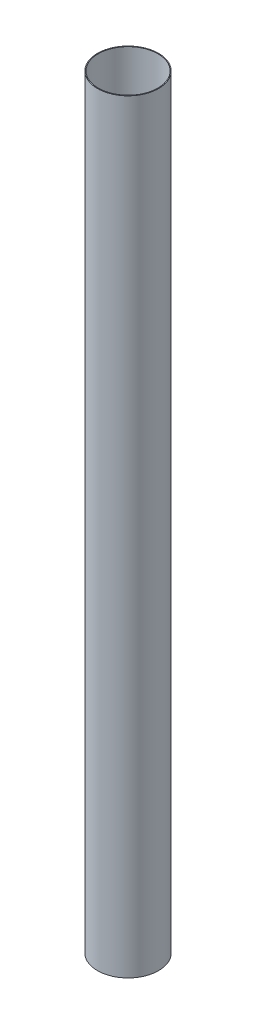
ISO-10303-21;
HEADER;
FILE_DESCRIPTION(('STEP AP214'),'2;1');
FILE_NAME('part.step','',(''),(''),'','','');
FILE_SCHEMA(('AUTOMOTIVE_DESIGN { 1 0 10303 214 1 1 1 1 }'));
ENDSEC;
DATA;
#1=APPLICATION_CONTEXT('core data for automotive mechanical design processes');
#2=APPLICATION_PROTOCOL_DEFINITION('international standard','automotive_design',2000,#1);
#3=PRODUCT_CONTEXT('',#1,'mechanical');
#4=PRODUCT('Part','Part','',(#3));
#5=PRODUCT_RELATED_PRODUCT_CATEGORY('part','',(#4));
#6=PRODUCT_DEFINITION_FORMATION('','',#4);
#7=PRODUCT_DEFINITION_CONTEXT('part definition',#1,'design');
#8=PRODUCT_DEFINITION('design','',#6,#7);
#9=PRODUCT_DEFINITION_SHAPE('','',#8);
#10=(LENGTH_UNIT() NAMED_UNIT(*) SI_UNIT(.MILLI.,.METRE.));
#11=(NAMED_UNIT(*) PLANE_ANGLE_UNIT() SI_UNIT($,.RADIAN.));
#12=(NAMED_UNIT(*) SI_UNIT($,.STERADIAN.) SOLID_ANGLE_UNIT());
#13=UNCERTAINTY_MEASURE_WITH_UNIT(LENGTH_MEASURE(1.E-05),#10,'distance_accuracy_value','');
#14=(GEOMETRIC_REPRESENTATION_CONTEXT(3) GLOBAL_UNCERTAINTY_ASSIGNED_CONTEXT((#13)) GLOBAL_UNIT_ASSIGNED_CONTEXT((#10,
#11,#12)) REPRESENTATION_CONTEXT('',''));
#15=CARTESIAN_POINT('',(0.,0.,0.));
#16=DIRECTION('',(0.,0.,1.));
#17=DIRECTION('',(1.,0.,0.));
#18=AXIS2_PLACEMENT_3D('',#15,#16,#17);
#19=CARTESIAN_POINT('',(0.,1270.,0.));
#20=DIRECTION('',(0.,1.,0.));
#21=DIRECTION('',(0.,0.,1.));
#22=AXIS2_PLACEMENT_3D('',#19,#20,#21);
#23=PLANE('',#22);
#24=CARTESIAN_POINT('',(0.,1270.,0.));
#25=DIRECTION('',(0.,1.,0.));
#26=DIRECTION('',(0.,0.,1.));
#27=AXIS2_PLACEMENT_3D('',#24,#25,#26);
#28=CIRCLE('',#27,50.8);
#29=CARTESIAN_POINT('',(0.,1270.,-50.8));
#30=VERTEX_POINT('',#29);
#31=EDGE_CURVE('E10',#30,#30,#28,.T.);
#32=ORIENTED_EDGE('',*,*,#31,.T.);
#33=EDGE_LOOP('',(#32));
#34=FACE_BOUND('',#33,.T.);
#35=CARTESIAN_POINT('',(0.,1270.,0.));
#36=DIRECTION('',(0.,1.,0.));
#37=DIRECTION('',(0.,0.,1.));
#38=AXIS2_PLACEMENT_3D('',#35,#36,#37);
#39=CIRCLE('',#38,49.53);
#40=CARTESIAN_POINT('',(0.,1270.,-49.53));
#41=VERTEX_POINT('',#40);
#42=EDGE_CURVE('E41',#41,#41,#39,.T.);
#43=ORIENTED_EDGE('',*,*,#42,.F.);
#44=EDGE_LOOP('',(#43));
#45=FACE_BOUND('',#44,.T.);
#46=ADVANCED_FACE('F30',(#34,#45),#23,.T.);
#47=CARTESIAN_POINT('',(0.,0.,0.));
#48=DIRECTION('',(0.,1.,0.));
#49=DIRECTION('',(0.,0.,1.));
#50=AXIS2_PLACEMENT_3D('',#47,#48,#49);
#51=PLANE('',#50);
#52=CARTESIAN_POINT('',(0.,0.,0.));
#53=DIRECTION('',(0.,1.,0.));
#54=DIRECTION('',(0.,0.,1.));
#55=AXIS2_PLACEMENT_3D('',#52,#53,#54);
#56=CIRCLE('',#55,50.8);
#57=CARTESIAN_POINT('',(0.,-2.22044604925031E-13,-50.8));
#58=VERTEX_POINT('',#57);
#59=EDGE_CURVE('E34',#58,#58,#56,.T.);
#60=ORIENTED_EDGE('',*,*,#59,.F.);
#61=EDGE_LOOP('',(#60));
#62=FACE_BOUND('',#61,.T.);
#63=CARTESIAN_POINT('',(0.,0.,0.));
#64=DIRECTION('',(0.,1.,0.));
#65=DIRECTION('',(0.,0.,1.));
#66=AXIS2_PLACEMENT_3D('',#63,#64,#65);
#67=CIRCLE('',#66,49.53);
#68=CARTESIAN_POINT('',(0.,-2.22044604925031E-13,-49.53));
#69=VERTEX_POINT('',#68);
#70=EDGE_CURVE('E43',#69,#69,#67,.T.);
#71=ORIENTED_EDGE('',*,*,#70,.T.);
#72=EDGE_LOOP('',(#71));
#73=FACE_BOUND('',#72,.T.);
#74=ADVANCED_FACE('F53',(#62,#73),#51,.F.);
#75=CARTESIAN_POINT('',(0.,1270.,0.));
#76=DIRECTION('',(0.,-1.,0.));
#77=DIRECTION('',(0.,0.,-1.));
#78=AXIS2_PLACEMENT_3D('',#75,#76,#77);
#79=CYLINDRICAL_SURFACE('',#78,50.8);
#80=CARTESIAN_POINT('',(0.,1270.,-50.8));
#81=CARTESIAN_POINT('',(0.,1256.77083333333,-50.8));
#82=CARTESIAN_POINT('',(0.,1243.54166666667,-50.8));
#83=CARTESIAN_POINT('',(0.,1217.08333333333,-50.8));
#84=CARTESIAN_POINT('',(0.,1203.85416666667,-50.8));
#85=CARTESIAN_POINT('',(0.,1177.39583333333,-50.8));
#86=CARTESIAN_POINT('',(0.,1164.16666666667,-50.8));
#87=CARTESIAN_POINT('',(0.,1137.70833333333,-50.8));
#88=CARTESIAN_POINT('',(0.,1124.47916666667,-50.8));
#89=CARTESIAN_POINT('',(0.,1098.02083333333,-50.8));
#90=CARTESIAN_POINT('',(0.,1084.79166666667,-50.8));
#91=CARTESIAN_POINT('',(0.,1058.33333333333,-50.8));
#92=CARTESIAN_POINT('',(0.,1045.10416666667,-50.8));
#93=CARTESIAN_POINT('',(0.,1018.64583333333,-50.8));
#94=CARTESIAN_POINT('',(0.,1005.41666666667,-50.8));
#95=CARTESIAN_POINT('',(0.,978.958333333333,-50.8));
#96=CARTESIAN_POINT('',(0.,965.729166666667,-50.8));
#97=CARTESIAN_POINT('',(0.,939.270833333333,-50.8));
#98=CARTESIAN_POINT('',(0.,926.041666666667,-50.8));
#99=CARTESIAN_POINT('',(0.,899.583333333333,-50.8));
#100=CARTESIAN_POINT('',(0.,886.354166666667,-50.8));
#101=CARTESIAN_POINT('',(0.,859.895833333333,-50.8));
#102=CARTESIAN_POINT('',(0.,846.666666666667,-50.8));
#103=CARTESIAN_POINT('',(0.,820.208333333333,-50.8));
#104=CARTESIAN_POINT('',(0.,806.979166666667,-50.8));
#105=CARTESIAN_POINT('',(0.,780.520833333333,-50.8));
#106=CARTESIAN_POINT('',(0.,767.291666666667,-50.8));
#107=CARTESIAN_POINT('',(0.,740.833333333333,-50.8));
#108=CARTESIAN_POINT('',(0.,727.604166666667,-50.8));
#109=CARTESIAN_POINT('',(0.,701.145833333333,-50.8));
#110=CARTESIAN_POINT('',(0.,687.916666666667,-50.8));
#111=CARTESIAN_POINT('',(0.,661.458333333333,-50.8));
#112=CARTESIAN_POINT('',(0.,648.229166666667,-50.8));
#113=CARTESIAN_POINT('',(0.,621.770833333333,-50.8));
#114=CARTESIAN_POINT('',(0.,608.541666666667,-50.8));
#115=CARTESIAN_POINT('',(0.,582.083333333333,-50.8));
#116=CARTESIAN_POINT('',(0.,568.854166666667,-50.8));
#117=CARTESIAN_POINT('',(0.,542.395833333333,-50.8));
#118=CARTESIAN_POINT('',(0.,529.166666666667,-50.8));
#119=CARTESIAN_POINT('',(0.,502.708333333333,-50.8));
#120=CARTESIAN_POINT('',(0.,489.479166666667,-50.8));
#121=CARTESIAN_POINT('',(0.,463.020833333333,-50.8));
#122=CARTESIAN_POINT('',(0.,449.791666666667,-50.8));
#123=CARTESIAN_POINT('',(0.,423.333333333333,-50.8));
#124=CARTESIAN_POINT('',(0.,410.104166666667,-50.8));
#125=CARTESIAN_POINT('',(0.,383.645833333333,-50.8));
#126=CARTESIAN_POINT('',(0.,370.416666666667,-50.8));
#127=CARTESIAN_POINT('',(0.,343.958333333333,-50.8));
#128=CARTESIAN_POINT('',(0.,330.729166666667,-50.8));
#129=CARTESIAN_POINT('',(0.,304.270833333333,-50.8));
#130=CARTESIAN_POINT('',(0.,291.041666666666,-50.8));
#131=CARTESIAN_POINT('',(0.,264.583333333333,-50.8));
#132=CARTESIAN_POINT('',(0.,251.354166666667,-50.8));
#133=CARTESIAN_POINT('',(0.,224.895833333333,-50.8));
#134=CARTESIAN_POINT('',(0.,211.666666666667,-50.8));
#135=CARTESIAN_POINT('',(0.,185.208333333333,-50.8));
#136=CARTESIAN_POINT('',(0.,171.979166666666,-50.8));
#137=CARTESIAN_POINT('',(0.,145.520833333333,-50.8));
#138=CARTESIAN_POINT('',(0.,132.291666666666,-50.8));
#139=CARTESIAN_POINT('',(0.,105.833333333333,-50.8));
#140=CARTESIAN_POINT('',(0.,92.6041666666664,-50.8));
#141=CARTESIAN_POINT('',(0.,66.1458333333331,-50.8));
#142=CARTESIAN_POINT('',(0.,52.9166666666665,-50.8));
#143=CARTESIAN_POINT('',(0.,26.4583333333332,-50.8));
#144=CARTESIAN_POINT('',(0.,13.2291666666665,-50.8));
#145=CARTESIAN_POINT('',(0.,-2.22044604925031E-13,-50.8));
#146=B_SPLINE_CURVE_WITH_KNOTS('',3,(#80,#81,#82,#83,#84,#85,#86,#87,#88,#89,#90,#91,#92,#93,
#94,#95,#96,#97,#98,#99,#100,#101,#102,#103,#104,#105,#106,#107,#108,#109,#110,#111,#112,#113,
#114,#115,#116,#117,#118,#119,#120,#121,#122,#123,#124,#125,#126,#127,#128,#129,#130,#131,#132,
#133,#134,#135,#136,#137,#138,#139,#140,#141,#142,#143,#144,#145),.UNSPECIFIED.,.F.,.F.,(4,2,2,
2,2,2,2,2,2,2,2,2,2,2,2,2,2,2,2,2,2,2,2,2,2,2,2,2,2,2,2,2,4),(0.,39.6874999999999,79.375,
119.0625,158.75,198.4375,238.125,277.8125,317.5,357.1875,396.875,436.5625,476.25,515.9375,
555.625,595.3125,635.,674.6875,714.375,754.0625,793.75,833.4375,873.125,912.8125,952.5,992.1875,
1031.875,1071.5625,1111.25,1150.9375,1190.625,1230.3125,1270.),.UNSPECIFIED.);
#147=EDGE_CURVE('BSEAM32',#30,#58,#146,.T.);
#148=ORIENTED_EDGE('',*,*,#31,.F.);
#149=ORIENTED_EDGE('',*,*,#59,.T.);
#150=ORIENTED_EDGE('',*,*,#147,.T.);
#151=ORIENTED_EDGE('',*,*,#147,.F.);
#152=EDGE_LOOP('',(#148,#150,#149,#151));
#153=FACE_BOUND('',#152,.T.);
#154=ADVANCED_FACE('F32',(#153),#79,.T.);
#155=CARTESIAN_POINT('',(0.,1270.,0.));
#156=DIRECTION('',(0.,-1.,0.));
#157=DIRECTION('',(0.,0.,-1.));
#158=AXIS2_PLACEMENT_3D('',#155,#156,#157);
#159=CYLINDRICAL_SURFACE('',#158,49.53);
#160=CARTESIAN_POINT('',(0.,1270.,-49.53));
#161=CARTESIAN_POINT('',(0.,1256.77083333333,-49.53));
#162=CARTESIAN_POINT('',(0.,1243.54166666667,-49.53));
#163=CARTESIAN_POINT('',(0.,1217.08333333333,-49.53));
#164=CARTESIAN_POINT('',(0.,1203.85416666667,-49.53));
#165=CARTESIAN_POINT('',(0.,1177.39583333333,-49.53));
#166=CARTESIAN_POINT('',(0.,1164.16666666667,-49.53));
#167=CARTESIAN_POINT('',(0.,1137.70833333333,-49.53));
#168=CARTESIAN_POINT('',(0.,1124.47916666667,-49.53));
#169=CARTESIAN_POINT('',(0.,1098.02083333333,-49.53));
#170=CARTESIAN_POINT('',(0.,1084.79166666667,-49.53));
#171=CARTESIAN_POINT('',(0.,1058.33333333333,-49.53));
#172=CARTESIAN_POINT('',(0.,1045.10416666667,-49.53));
#173=CARTESIAN_POINT('',(0.,1018.64583333333,-49.53));
#174=CARTESIAN_POINT('',(0.,1005.41666666667,-49.53));
#175=CARTESIAN_POINT('',(0.,978.958333333333,-49.53));
#176=CARTESIAN_POINT('',(0.,965.729166666667,-49.53));
#177=CARTESIAN_POINT('',(0.,939.270833333333,-49.53));
#178=CARTESIAN_POINT('',(0.,926.041666666667,-49.53));
#179=CARTESIAN_POINT('',(0.,899.583333333333,-49.53));
#180=CARTESIAN_POINT('',(0.,886.354166666666,-49.53));
#181=CARTESIAN_POINT('',(0.,859.895833333333,-49.53));
#182=CARTESIAN_POINT('',(0.,846.666666666666,-49.53));
#183=CARTESIAN_POINT('',(0.,820.208333333333,-49.53));
#184=CARTESIAN_POINT('',(0.,806.979166666667,-49.53));
#185=CARTESIAN_POINT('',(0.,780.520833333333,-49.53));
#186=CARTESIAN_POINT('',(0.,767.291666666667,-49.53));
#187=CARTESIAN_POINT('',(0.,740.833333333333,-49.53));
#188=CARTESIAN_POINT('',(0.,727.604166666667,-49.53));
#189=CARTESIAN_POINT('',(0.,701.145833333333,-49.53));
#190=CARTESIAN_POINT('',(0.,687.916666666666,-49.53));
#191=CARTESIAN_POINT('',(0.,661.458333333333,-49.53));
#192=CARTESIAN_POINT('',(0.,648.229166666666,-49.53));
#193=CARTESIAN_POINT('',(0.,621.770833333333,-49.53));
#194=CARTESIAN_POINT('',(0.,608.541666666666,-49.53));
#195=CARTESIAN_POINT('',(0.,582.083333333333,-49.53));
#196=CARTESIAN_POINT('',(0.,568.854166666666,-49.53));
#197=CARTESIAN_POINT('',(0.,542.395833333333,-49.53));
#198=CARTESIAN_POINT('',(0.,529.166666666666,-49.53));
#199=CARTESIAN_POINT('',(0.,502.708333333333,-49.53));
#200=CARTESIAN_POINT('',(0.,489.479166666666,-49.53));
#201=CARTESIAN_POINT('',(0.,463.020833333333,-49.53));
#202=CARTESIAN_POINT('',(0.,449.791666666666,-49.53));
#203=CARTESIAN_POINT('',(0.,423.333333333333,-49.53));
#204=CARTESIAN_POINT('',(0.,410.104166666666,-49.53));
#205=CARTESIAN_POINT('',(0.,383.645833333333,-49.53));
#206=CARTESIAN_POINT('',(0.,370.416666666666,-49.53));
#207=CARTESIAN_POINT('',(0.,343.958333333333,-49.53));
#208=CARTESIAN_POINT('',(0.,330.729166666666,-49.53));
#209=CARTESIAN_POINT('',(0.,304.270833333333,-49.53));
#210=CARTESIAN_POINT('',(0.,291.041666666666,-49.53));
#211=CARTESIAN_POINT('',(0.,264.583333333333,-49.53));
#212=CARTESIAN_POINT('',(0.,251.354166666666,-49.53));
#213=CARTESIAN_POINT('',(0.,224.895833333333,-49.53));
#214=CARTESIAN_POINT('',(0.,211.666666666667,-49.53));
#215=CARTESIAN_POINT('',(0.,185.208333333333,-49.53));
#216=CARTESIAN_POINT('',(0.,171.979166666666,-49.53));
#217=CARTESIAN_POINT('',(0.,145.520833333333,-49.53));
#218=CARTESIAN_POINT('',(0.,132.291666666666,-49.53));
#219=CARTESIAN_POINT('',(0.,105.833333333333,-49.53));
#220=CARTESIAN_POINT('',(0.,92.6041666666664,-49.53));
#221=CARTESIAN_POINT('',(0.,66.1458333333331,-49.53));
#222=CARTESIAN_POINT('',(0.,52.9166666666665,-49.53));
#223=CARTESIAN_POINT('',(0.,26.4583333333332,-49.53));
#224=CARTESIAN_POINT('',(0.,13.2291666666665,-49.53));
#225=CARTESIAN_POINT('',(0.,-2.22044604925031E-13,-49.53));
#226=B_SPLINE_CURVE_WITH_KNOTS('',3,(#160,#161,#162,#163,#164,#165,#166,#167,#168,#169,#170,
#171,#172,#173,#174,#175,#176,#177,#178,#179,#180,#181,#182,#183,#184,#185,#186,#187,#188,#189,
#190,#191,#192,#193,#194,#195,#196,#197,#198,#199,#200,#201,#202,#203,#204,#205,#206,#207,#208,
#209,#210,#211,#212,#213,#214,#215,#216,#217,#218,#219,#220,#221,#222,#223,#224,#225),
.UNSPECIFIED.,.F.,.F.,(4,2,2,2,2,2,2,2,2,2,2,2,2,2,2,2,2,2,2,2,2,2,2,2,2,2,2,2,2,2,2,2,4),(0.,
39.6875000000001,79.3750000000002,119.0625,158.75,198.4375,238.125,277.8125,317.5,357.1875,
396.875,436.5625,476.25,515.9375,555.625,595.3125,635.,674.6875,714.375,754.0625,793.75,
833.4375,873.125,912.8125,952.5,992.1875,1031.875,1071.5625,1111.25,1150.9375,1190.625,
1230.3125,1270.),.UNSPECIFIED.);
#227=EDGE_CURVE('BSEAM49',#41,#69,#226,.T.);
#228=ORIENTED_EDGE('',*,*,#42,.T.);
#229=ORIENTED_EDGE('',*,*,#70,.F.);
#230=ORIENTED_EDGE('',*,*,#227,.T.);
#231=ORIENTED_EDGE('',*,*,#227,.F.);
#232=EDGE_LOOP('',(#228,#230,#229,#231));
#233=FACE_BOUND('',#232,.T.);
#234=ADVANCED_FACE('F49',(#233),#159,.F.);
#235=CLOSED_SHELL('',(#46,#74,#154,#234));
#236=MANIFOLD_SOLID_BREP('B2',#235);
#237=ADVANCED_BREP_SHAPE_REPRESENTATION('',(#18,#236),#14);
#238=SHAPE_DEFINITION_REPRESENTATION(#9,#237);
ENDSEC;
END-ISO-10303-21;
